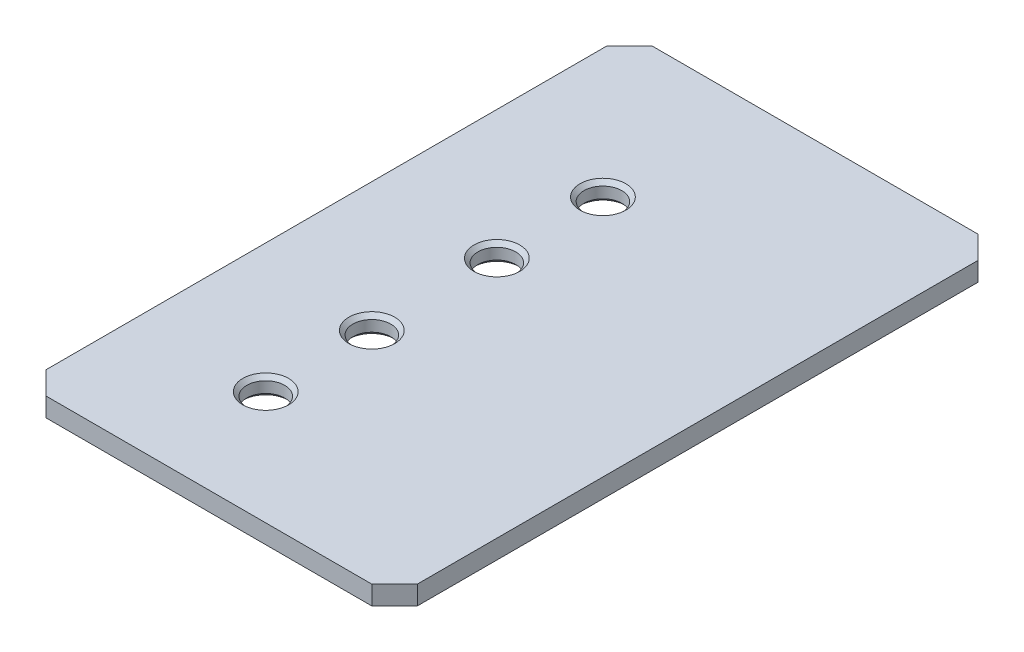
ISO-10303-21;
HEADER;
FILE_DESCRIPTION(('STEP AP214'),'2;1');
FILE_NAME('part.step','',(''),(''),'','','');
FILE_SCHEMA(('AUTOMOTIVE_DESIGN { 1 0 10303 214 1 1 1 1 }'));
ENDSEC;
DATA;
#1=APPLICATION_CONTEXT('core data for automotive mechanical design processes');
#2=APPLICATION_PROTOCOL_DEFINITION('international standard','automotive_design',2000,#1);
#3=PRODUCT_CONTEXT('',#1,'mechanical');
#4=PRODUCT('Part','Part','',(#3));
#5=PRODUCT_RELATED_PRODUCT_CATEGORY('part','',(#4));
#6=PRODUCT_DEFINITION_FORMATION('','',#4);
#7=PRODUCT_DEFINITION_CONTEXT('part definition',#1,'design');
#8=PRODUCT_DEFINITION('design','',#6,#7);
#9=PRODUCT_DEFINITION_SHAPE('','',#8);
#10=(LENGTH_UNIT() NAMED_UNIT(*) SI_UNIT(.MILLI.,.METRE.));
#11=(NAMED_UNIT(*) PLANE_ANGLE_UNIT() SI_UNIT($,.RADIAN.));
#12=(NAMED_UNIT(*) SI_UNIT($,.STERADIAN.) SOLID_ANGLE_UNIT());
#13=UNCERTAINTY_MEASURE_WITH_UNIT(LENGTH_MEASURE(1.E-05),#10,'distance_accuracy_value','');
#14=(GEOMETRIC_REPRESENTATION_CONTEXT(3) GLOBAL_UNCERTAINTY_ASSIGNED_CONTEXT((#13)) GLOBAL_UNIT_ASSIGNED_CONTEXT((#10,
#11,#12)) REPRESENTATION_CONTEXT('',''));
#15=CARTESIAN_POINT('',(0.,0.,0.));
#16=DIRECTION('',(0.,0.,1.));
#17=DIRECTION('',(1.,0.,0.));
#18=AXIS2_PLACEMENT_3D('',#15,#16,#17);
#19=CARTESIAN_POINT('',(-24.5,2.5,-37.));
#20=DIRECTION('',(0.707106781186546,0.,0.707106781186549));
#21=DIRECTION('',(0.,-1.,0.));
#22=AXIS2_PLACEMENT_3D('',#19,#20,#21);
#23=PLANE('',#22);
#24=DIRECTION('',(-0.707106781186549,0.,0.707106781186546));
#25=VECTOR('',#24,1.);
#26=CARTESIAN_POINT('',(-30.75,2.5,-30.75));
#27=LINE('',#26,#25);
#28=CARTESIAN_POINT('',(-21.5,2.5,-40.));
#29=VERTEX_POINT('',#28);
#30=CARTESIAN_POINT('',(-24.5,2.5,-37.));
#31=VERTEX_POINT('',#30);
#32=EDGE_CURVE('E169',#29,#31,#27,.T.);
#33=ORIENTED_EDGE('',*,*,#32,.F.);
#34=DIRECTION('',(0.,1.,0.));
#35=VECTOR('',#34,1.);
#36=CARTESIAN_POINT('',(-21.5,2.5,-40.));
#37=LINE('',#36,#35);
#38=CARTESIAN_POINT('',(-21.5,0.,-40.));
#39=VERTEX_POINT('',#38);
#40=EDGE_CURVE('E185',#39,#29,#37,.T.);
#41=ORIENTED_EDGE('',*,*,#40,.F.);
#42=DIRECTION('',(0.707106781186549,0.,-0.707106781186546));
#43=VECTOR('',#42,1.);
#44=CARTESIAN_POINT('',(-24.5,0.,-37.));
#45=LINE('',#44,#43);
#46=CARTESIAN_POINT('',(-24.5,0.,-37.));
#47=VERTEX_POINT('',#46);
#48=EDGE_CURVE('E272',#47,#39,#45,.T.);
#49=ORIENTED_EDGE('',*,*,#48,.F.);
#50=DIRECTION('',(0.,-1.,0.));
#51=VECTOR('',#50,1.);
#52=CARTESIAN_POINT('',(-24.5,2.5,-37.));
#53=LINE('',#52,#51);
#54=EDGE_CURVE('E221',#31,#47,#53,.T.);
#55=ORIENTED_EDGE('',*,*,#54,.F.);
#56=EDGE_LOOP('',(#33,#41,#49,#55));
#57=FACE_BOUND('',#56,.T.);
#58=ADVANCED_FACE('F17',(#57),#23,.F.);
#59=CARTESIAN_POINT('',(-21.5,2.5,40.));
#60=DIRECTION('',(0.707106781186549,0.,-0.707106781186546));
#61=DIRECTION('',(0.,-1.,0.));
#62=AXIS2_PLACEMENT_3D('',#59,#60,#61);
#63=PLANE('',#62);
#64=DIRECTION('',(0.707106781186546,0.,0.707106781186549));
#65=VECTOR('',#64,1.);
#66=CARTESIAN_POINT('',(-30.75,2.5,30.75));
#67=LINE('',#66,#65);
#68=CARTESIAN_POINT('',(-24.5,2.5,37.));
#69=VERTEX_POINT('',#68);
#70=CARTESIAN_POINT('',(-21.5,2.5,40.));
#71=VERTEX_POINT('',#70);
#72=EDGE_CURVE('E209',#69,#71,#67,.T.);
#73=ORIENTED_EDGE('',*,*,#72,.F.);
#74=DIRECTION('',(0.,1.,0.));
#75=VECTOR('',#74,1.);
#76=CARTESIAN_POINT('',(-24.5,2.5,37.));
#77=LINE('',#76,#75);
#78=CARTESIAN_POINT('',(-24.5,0.,37.));
#79=VERTEX_POINT('',#78);
#80=EDGE_CURVE('E200',#79,#69,#77,.T.);
#81=ORIENTED_EDGE('',*,*,#80,.F.);
#82=DIRECTION('',(-0.707106781186546,0.,-0.707106781186549));
#83=VECTOR('',#82,1.);
#84=CARTESIAN_POINT('',(-21.5,0.,40.));
#85=LINE('',#84,#83);
#86=CARTESIAN_POINT('',(-21.5,0.,40.));
#87=VERTEX_POINT('',#86);
#88=EDGE_CURVE('E268',#87,#79,#85,.T.);
#89=ORIENTED_EDGE('',*,*,#88,.F.);
#90=DIRECTION('',(0.,-1.,0.));
#91=VECTOR('',#90,1.);
#92=CARTESIAN_POINT('',(-21.5,2.5,40.));
#93=LINE('',#92,#91);
#94=EDGE_CURVE('E213',#71,#87,#93,.T.);
#95=ORIENTED_EDGE('',*,*,#94,.F.);
#96=EDGE_LOOP('',(#73,#81,#89,#95));
#97=FACE_BOUND('',#96,.T.);
#98=ADVANCED_FACE('F531',(#97),#63,.F.);
#99=CARTESIAN_POINT('',(21.5,2.5,-40.));
#100=DIRECTION('',(-0.707106781186548,0.,0.707106781186548));
#101=DIRECTION('',(0.,1.,0.));
#102=AXIS2_PLACEMENT_3D('',#99,#100,#101);
#103=PLANE('',#102);
#104=DIRECTION('',(-0.707106781186548,0.,-0.707106781186548));
#105=VECTOR('',#104,1.);
#106=CARTESIAN_POINT('',(30.75,2.5,-30.75));
#107=LINE('',#106,#105);
#108=CARTESIAN_POINT('',(24.5,2.5,-37.));
#109=VERTEX_POINT('',#108);
#110=CARTESIAN_POINT('',(21.5,2.5,-40.));
#111=VERTEX_POINT('',#110);
#112=EDGE_CURVE('E157',#109,#111,#107,.T.);
#113=ORIENTED_EDGE('',*,*,#112,.F.);
#114=DIRECTION('',(0.,1.,0.));
#115=VECTOR('',#114,1.);
#116=CARTESIAN_POINT('',(24.5,2.5,-37.));
#117=LINE('',#116,#115);
#118=CARTESIAN_POINT('',(24.5,0.,-37.));
#119=VERTEX_POINT('',#118);
#120=EDGE_CURVE('E187',#119,#109,#117,.T.);
#121=ORIENTED_EDGE('',*,*,#120,.F.);
#122=DIRECTION('',(0.707106781186548,0.,0.707106781186548));
#123=VECTOR('',#122,1.);
#124=CARTESIAN_POINT('',(21.5,0.,-40.));
#125=LINE('',#124,#123);
#126=CARTESIAN_POINT('',(21.5,0.,-40.));
#127=VERTEX_POINT('',#126);
#128=EDGE_CURVE('E175',#127,#119,#125,.T.);
#129=ORIENTED_EDGE('',*,*,#128,.F.);
#130=DIRECTION('',(0.,-1.,0.));
#131=VECTOR('',#130,1.);
#132=CARTESIAN_POINT('',(21.5,2.5,-40.));
#133=LINE('',#132,#131);
#134=EDGE_CURVE('E173',#111,#127,#133,.T.);
#135=ORIENTED_EDGE('',*,*,#134,.F.);
#136=EDGE_LOOP('',(#113,#121,#129,#135));
#137=FACE_BOUND('',#136,.T.);
#138=ADVANCED_FACE('F174',(#137),#103,.F.);
#139=CARTESIAN_POINT('',(24.5,2.5,37.));
#140=DIRECTION('',(-0.707106781186548,0.,-0.707106781186548));
#141=DIRECTION('',(-0.707106781186548,0.,0.707106781186548));
#142=AXIS2_PLACEMENT_3D('',#139,#140,#141);
#143=PLANE('',#142);
#144=DIRECTION('',(0.707106781186548,0.,-0.707106781186548));
#145=VECTOR('',#144,1.);
#146=CARTESIAN_POINT('',(30.75,2.5,30.75));
#147=LINE('',#146,#145);
#148=CARTESIAN_POINT('',(21.5,2.5,40.));
#149=VERTEX_POINT('',#148);
#150=CARTESIAN_POINT('',(24.5,2.5,37.));
#151=VERTEX_POINT('',#150);
#152=EDGE_CURVE('E170',#149,#151,#147,.T.);
#153=ORIENTED_EDGE('',*,*,#152,.F.);
#154=DIRECTION('',(0.,1.,0.));
#155=VECTOR('',#154,1.);
#156=CARTESIAN_POINT('',(21.5,2.5,40.));
#157=LINE('',#156,#155);
#158=CARTESIAN_POINT('',(21.5,0.,40.));
#159=VERTEX_POINT('',#158);
#160=EDGE_CURVE('E233',#159,#149,#157,.T.);
#161=ORIENTED_EDGE('',*,*,#160,.F.);
#162=DIRECTION('',(-0.707106781186548,0.,0.707106781186548));
#163=VECTOR('',#162,1.);
#164=CARTESIAN_POINT('',(24.5,0.,37.));
#165=LINE('',#164,#163);
#166=CARTESIAN_POINT('',(24.5,0.,37.));
#167=VERTEX_POINT('',#166);
#168=EDGE_CURVE('E229',#167,#159,#165,.T.);
#169=ORIENTED_EDGE('',*,*,#168,.F.);
#170=DIRECTION('',(0.,-1.,0.));
#171=VECTOR('',#170,1.);
#172=CARTESIAN_POINT('',(24.5,2.5,37.));
#173=LINE('',#172,#171);
#174=EDGE_CURVE('E212',#151,#167,#173,.T.);
#175=ORIENTED_EDGE('',*,*,#174,.F.);
#176=EDGE_LOOP('',(#153,#161,#169,#175));
#177=FACE_BOUND('',#176,.T.);
#178=ADVANCED_FACE('F510',(#177),#143,.F.);
#179=CARTESIAN_POINT('',(-7.5,2.5,-19.5));
#180=DIRECTION('',(0.,1.,0.));
#181=DIRECTION('',(0.,0.,1.));
#182=AXIS2_PLACEMENT_3D('',#179,#180,#181);
#183=CONICAL_SURFACE('',#182,3.025,0.785398163397446);
#184=CARTESIAN_POINT('',(-7.5,1.975,-19.5));
#185=DIRECTION('',(0.,1.,0.));
#186=DIRECTION('',(0.,0.,1.));
#187=AXIS2_PLACEMENT_3D('',#184,#185,#186);
#188=CIRCLE('',#187,2.5);
#189=CARTESIAN_POINT('',(-7.5,1.975,-17.));
#190=VERTEX_POINT('',#189);
#191=EDGE_CURVE('E11',#190,#190,#188,.T.);
#192=ORIENTED_EDGE('',*,*,#191,.F.);
#193=EDGE_LOOP('',(#192));
#194=FACE_BOUND('',#193,.T.);
#195=CARTESIAN_POINT('',(-7.5,2.5,-19.5));
#196=DIRECTION('',(0.,1.,0.));
#197=DIRECTION('',(0.,0.,1.));
#198=AXIS2_PLACEMENT_3D('',#195,#196,#197);
#199=CIRCLE('',#198,3.025);
#200=CARTESIAN_POINT('',(-7.5,2.5,-16.475));
#201=VERTEX_POINT('',#200);
#202=EDGE_CURVE('E205',#201,#201,#199,.T.);
#203=ORIENTED_EDGE('',*,*,#202,.T.);
#204=EDGE_LOOP('',(#203));
#205=FACE_BOUND('',#204,.T.);
#206=ADVANCED_FACE('F500',(#194,#205),#183,.F.);
#207=CARTESIAN_POINT('',(-7.5,2.5,-19.5));
#208=DIRECTION('',(0.,1.,0.));
#209=DIRECTION('',(0.,0.,1.));
#210=AXIS2_PLACEMENT_3D('',#207,#208,#209);
#211=CYLINDRICAL_SURFACE('',#210,2.5);
#212=CARTESIAN_POINT('',(-7.5,0.525,-19.5));
#213=DIRECTION('',(0.,1.,0.));
#214=DIRECTION('',(0.,0.,1.));
#215=AXIS2_PLACEMENT_3D('',#212,#213,#214);
#216=CIRCLE('',#215,2.5);
#217=CARTESIAN_POINT('',(-7.5,0.525,-17.));
#218=VERTEX_POINT('',#217);
#219=EDGE_CURVE('E27',#218,#218,#216,.T.);
#220=ORIENTED_EDGE('',*,*,#219,.F.);
#221=EDGE_LOOP('',(#220));
#222=FACE_BOUND('',#221,.T.);
#223=ORIENTED_EDGE('',*,*,#191,.T.);
#224=EDGE_LOOP('',(#223));
#225=FACE_BOUND('',#224,.T.);
#226=ADVANCED_FACE('F490',(#222,#225),#211,.F.);
#227=CARTESIAN_POINT('',(-7.5,0.525,-19.5));
#228=DIRECTION('',(0.,-1.,0.));
#229=DIRECTION('',(0.,0.,-1.));
#230=AXIS2_PLACEMENT_3D('',#227,#228,#229);
#231=CONICAL_SURFACE('',#230,2.5,0.785398163397446);
#232=ORIENTED_EDGE('',*,*,#219,.T.);
#233=EDGE_LOOP('',(#232));
#234=FACE_BOUND('',#233,.T.);
#235=CARTESIAN_POINT('',(-7.5,0.,-19.5));
#236=DIRECTION('',(0.,1.,0.));
#237=DIRECTION('',(0.,0.,1.));
#238=AXIS2_PLACEMENT_3D('',#235,#236,#237);
#239=CIRCLE('',#238,3.025);
#240=CARTESIAN_POINT('',(-7.5,0.,-16.475));
#241=VERTEX_POINT('',#240);
#242=EDGE_CURVE('E201',#241,#241,#239,.T.);
#243=ORIENTED_EDGE('',*,*,#242,.F.);
#244=EDGE_LOOP('',(#243));
#245=FACE_BOUND('',#244,.T.);
#246=ADVANCED_FACE('F480',(#234,#245),#231,.F.);
#247=CARTESIAN_POINT('',(-7.5,2.5,-5.5));
#248=DIRECTION('',(0.,1.,0.));
#249=DIRECTION('',(0.,0.,1.));
#250=AXIS2_PLACEMENT_3D('',#247,#248,#249);
#251=CONICAL_SURFACE('',#250,3.025,0.785398163397446);
#252=CARTESIAN_POINT('',(-7.5,1.975,-5.5));
#253=DIRECTION('',(0.,1.,0.));
#254=DIRECTION('',(0.,0.,1.));
#255=AXIS2_PLACEMENT_3D('',#252,#253,#254);
#256=CIRCLE('',#255,2.5);
#257=CARTESIAN_POINT('',(-7.5,1.975,-3.));
#258=VERTEX_POINT('',#257);
#259=EDGE_CURVE('E20',#258,#258,#256,.T.);
#260=ORIENTED_EDGE('',*,*,#259,.F.);
#261=EDGE_LOOP('',(#260));
#262=FACE_BOUND('',#261,.T.);
#263=CARTESIAN_POINT('',(-7.5,2.5,-5.5));
#264=DIRECTION('',(0.,1.,0.));
#265=DIRECTION('',(0.,0.,1.));
#266=AXIS2_PLACEMENT_3D('',#263,#264,#265);
#267=CIRCLE('',#266,3.025);
#268=CARTESIAN_POINT('',(-7.5,2.5,-2.475));
#269=VERTEX_POINT('',#268);
#270=EDGE_CURVE('E208',#269,#269,#267,.T.);
#271=ORIENTED_EDGE('',*,*,#270,.T.);
#272=EDGE_LOOP('',(#271));
#273=FACE_BOUND('',#272,.T.);
#274=ADVANCED_FACE('F469',(#262,#273),#251,.F.);
#275=CARTESIAN_POINT('',(-7.5,2.5,-5.5));
#276=DIRECTION('',(0.,1.,0.));
#277=DIRECTION('',(0.,0.,1.));
#278=AXIS2_PLACEMENT_3D('',#275,#276,#277);
#279=CYLINDRICAL_SURFACE('',#278,2.5);
#280=CARTESIAN_POINT('',(-7.5,0.525,-5.5));
#281=DIRECTION('',(0.,1.,0.));
#282=DIRECTION('',(0.,0.,1.));
#283=AXIS2_PLACEMENT_3D('',#280,#281,#282);
#284=CIRCLE('',#283,2.5);
#285=CARTESIAN_POINT('',(-7.5,0.525,-3.));
#286=VERTEX_POINT('',#285);
#287=EDGE_CURVE('E112',#286,#286,#284,.T.);
#288=ORIENTED_EDGE('',*,*,#287,.F.);
#289=EDGE_LOOP('',(#288));
#290=FACE_BOUND('',#289,.T.);
#291=ORIENTED_EDGE('',*,*,#259,.T.);
#292=EDGE_LOOP('',(#291));
#293=FACE_BOUND('',#292,.T.);
#294=ADVANCED_FACE('F460',(#290,#293),#279,.F.);
#295=CARTESIAN_POINT('',(-7.5,0.525,-5.5));
#296=DIRECTION('',(0.,-1.,0.));
#297=DIRECTION('',(0.,0.,-1.));
#298=AXIS2_PLACEMENT_3D('',#295,#296,#297);
#299=CONICAL_SURFACE('',#298,2.5,0.785398163397446);
#300=ORIENTED_EDGE('',*,*,#287,.T.);
#301=EDGE_LOOP('',(#300));
#302=FACE_BOUND('',#301,.T.);
#303=CARTESIAN_POINT('',(-7.5,0.,-5.5));
#304=DIRECTION('',(0.,1.,0.));
#305=DIRECTION('',(0.,0.,1.));
#306=AXIS2_PLACEMENT_3D('',#303,#304,#305);
#307=CIRCLE('',#306,3.025);
#308=CARTESIAN_POINT('',(-7.5,0.,-2.475));
#309=VERTEX_POINT('',#308);
#310=EDGE_CURVE('E204',#309,#309,#307,.T.);
#311=ORIENTED_EDGE('',*,*,#310,.F.);
#312=EDGE_LOOP('',(#311));
#313=FACE_BOUND('',#312,.T.);
#314=ADVANCED_FACE('F450',(#302,#313),#299,.F.);
#315=CARTESIAN_POINT('',(-7.5,2.5,25.));
#316=DIRECTION('',(0.,1.,0.));
#317=DIRECTION('',(0.,0.,1.));
#318=AXIS2_PLACEMENT_3D('',#315,#316,#317);
#319=CONICAL_SURFACE('',#318,3.025,0.785398163397446);
#320=CARTESIAN_POINT('',(-7.5,1.975,25.));
#321=DIRECTION('',(0.,1.,0.));
#322=DIRECTION('',(0.,0.,1.));
#323=AXIS2_PLACEMENT_3D('',#320,#321,#322);
#324=CIRCLE('',#323,2.5);
#325=CARTESIAN_POINT('',(-7.5,1.975,27.5));
#326=VERTEX_POINT('',#325);
#327=EDGE_CURVE('E243',#326,#326,#324,.T.);
#328=ORIENTED_EDGE('',*,*,#327,.F.);
#329=EDGE_LOOP('',(#328));
#330=FACE_BOUND('',#329,.T.);
#331=CARTESIAN_POINT('',(-7.5,2.5,25.));
#332=DIRECTION('',(0.,1.,0.));
#333=DIRECTION('',(0.,0.,1.));
#334=AXIS2_PLACEMENT_3D('',#331,#332,#333);
#335=CIRCLE('',#334,3.025);
#336=CARTESIAN_POINT('',(-7.5,2.5,28.025));
#337=VERTEX_POINT('',#336);
#338=EDGE_CURVE('E230',#337,#337,#335,.T.);
#339=ORIENTED_EDGE('',*,*,#338,.T.);
#340=EDGE_LOOP('',(#339));
#341=FACE_BOUND('',#340,.T.);
#342=ADVANCED_FACE('F439',(#330,#341),#319,.F.);
#343=CARTESIAN_POINT('',(-7.5,2.5,25.));
#344=DIRECTION('',(0.,1.,0.));
#345=DIRECTION('',(0.,0.,1.));
#346=AXIS2_PLACEMENT_3D('',#343,#344,#345);
#347=CYLINDRICAL_SURFACE('',#346,2.5);
#348=CARTESIAN_POINT('',(-7.5,0.525,25.));
#349=DIRECTION('',(0.,1.,0.));
#350=DIRECTION('',(0.,0.,1.));
#351=AXIS2_PLACEMENT_3D('',#348,#349,#350);
#352=CIRCLE('',#351,2.5);
#353=CARTESIAN_POINT('',(-7.5,0.525,27.5));
#354=VERTEX_POINT('',#353);
#355=EDGE_CURVE('E246',#354,#354,#352,.T.);
#356=ORIENTED_EDGE('',*,*,#355,.F.);
#357=EDGE_LOOP('',(#356));
#358=FACE_BOUND('',#357,.T.);
#359=ORIENTED_EDGE('',*,*,#327,.T.);
#360=EDGE_LOOP('',(#359));
#361=FACE_BOUND('',#360,.T.);
#362=ADVANCED_FACE('F427',(#358,#361),#347,.F.);
#363=CARTESIAN_POINT('',(-7.5,0.525,25.));
#364=DIRECTION('',(0.,-1.,0.));
#365=DIRECTION('',(0.,0.,-1.));
#366=AXIS2_PLACEMENT_3D('',#363,#364,#365);
#367=CONICAL_SURFACE('',#366,2.5,0.785398163397446);
#368=ORIENTED_EDGE('',*,*,#355,.T.);
#369=EDGE_LOOP('',(#368));
#370=FACE_BOUND('',#369,.T.);
#371=CARTESIAN_POINT('',(-7.5,0.,25.));
#372=DIRECTION('',(0.,1.,0.));
#373=DIRECTION('',(0.,0.,1.));
#374=AXIS2_PLACEMENT_3D('',#371,#372,#373);
#375=CIRCLE('',#374,3.025);
#376=CARTESIAN_POINT('',(-7.5,0.,28.025));
#377=VERTEX_POINT('',#376);
#378=EDGE_CURVE('E284',#377,#377,#375,.T.);
#379=ORIENTED_EDGE('',*,*,#378,.F.);
#380=EDGE_LOOP('',(#379));
#381=FACE_BOUND('',#380,.T.);
#382=ADVANCED_FACE('F416',(#370,#381),#367,.F.);
#383=CARTESIAN_POINT('',(-7.5,2.5,11.));
#384=DIRECTION('',(0.,1.,0.));
#385=DIRECTION('',(0.,0.,1.));
#386=AXIS2_PLACEMENT_3D('',#383,#384,#385);
#387=CONICAL_SURFACE('',#386,3.025,0.785398163397446);
#388=CARTESIAN_POINT('',(-7.5,1.975,11.));
#389=DIRECTION('',(0.,1.,0.));
#390=DIRECTION('',(0.,0.,1.));
#391=AXIS2_PLACEMENT_3D('',#388,#389,#390);
#392=CIRCLE('',#391,2.5);
#393=CARTESIAN_POINT('',(-7.5,1.975,13.5));
#394=VERTEX_POINT('',#393);
#395=EDGE_CURVE('E293',#394,#394,#392,.T.);
#396=ORIENTED_EDGE('',*,*,#395,.F.);
#397=EDGE_LOOP('',(#396));
#398=FACE_BOUND('',#397,.T.);
#399=CARTESIAN_POINT('',(-7.5,2.5,11.));
#400=DIRECTION('',(0.,1.,0.));
#401=DIRECTION('',(0.,0.,1.));
#402=AXIS2_PLACEMENT_3D('',#399,#400,#401);
#403=CIRCLE('',#402,3.025);
#404=CARTESIAN_POINT('',(-7.5,2.5,14.025));
#405=VERTEX_POINT('',#404);
#406=EDGE_CURVE('E226',#405,#405,#403,.T.);
#407=ORIENTED_EDGE('',*,*,#406,.T.);
#408=EDGE_LOOP('',(#407));
#409=FACE_BOUND('',#408,.T.);
#410=ADVANCED_FACE('F405',(#398,#409),#387,.F.);
#411=CARTESIAN_POINT('',(-7.5,2.5,11.));
#412=DIRECTION('',(0.,1.,0.));
#413=DIRECTION('',(0.,0.,1.));
#414=AXIS2_PLACEMENT_3D('',#411,#412,#413);
#415=CYLINDRICAL_SURFACE('',#414,2.5);
#416=CARTESIAN_POINT('',(-7.5,0.525,11.));
#417=DIRECTION('',(0.,1.,0.));
#418=DIRECTION('',(0.,0.,1.));
#419=AXIS2_PLACEMENT_3D('',#416,#417,#418);
#420=CIRCLE('',#419,2.5);
#421=CARTESIAN_POINT('',(-7.5,0.525,13.5));
#422=VERTEX_POINT('',#421);
#423=EDGE_CURVE('E290',#422,#422,#420,.T.);
#424=ORIENTED_EDGE('',*,*,#423,.F.);
#425=EDGE_LOOP('',(#424));
#426=FACE_BOUND('',#425,.T.);
#427=ORIENTED_EDGE('',*,*,#395,.T.);
#428=EDGE_LOOP('',(#427));
#429=FACE_BOUND('',#428,.T.);
#430=ADVANCED_FACE('F394',(#426,#429),#415,.F.);
#431=CARTESIAN_POINT('',(-7.5,0.525,11.));
#432=DIRECTION('',(0.,-1.,0.));
#433=DIRECTION('',(0.,0.,-1.));
#434=AXIS2_PLACEMENT_3D('',#431,#432,#433);
#435=CONICAL_SURFACE('',#434,2.5,0.785398163397446);
#436=ORIENTED_EDGE('',*,*,#423,.T.);
#437=EDGE_LOOP('',(#436));
#438=FACE_BOUND('',#437,.T.);
#439=CARTESIAN_POINT('',(-7.5,0.,11.));
#440=DIRECTION('',(0.,1.,0.));
#441=DIRECTION('',(0.,0.,1.));
#442=AXIS2_PLACEMENT_3D('',#439,#440,#441);
#443=CIRCLE('',#442,3.025);
#444=CARTESIAN_POINT('',(-7.5,0.,14.025));
#445=VERTEX_POINT('',#444);
#446=EDGE_CURVE('E287',#445,#445,#443,.T.);
#447=ORIENTED_EDGE('',*,*,#446,.F.);
#448=EDGE_LOOP('',(#447));
#449=FACE_BOUND('',#448,.T.);
#450=ADVANCED_FACE('F383',(#438,#449),#435,.F.);
#451=CARTESIAN_POINT('',(0.,0.,0.));
#452=DIRECTION('',(0.,1.,0.));
#453=DIRECTION('',(1.,0.,0.));
#454=AXIS2_PLACEMENT_3D('',#451,#452,#453);
#455=PLANE('',#454);
#456=ORIENTED_EDGE('',*,*,#446,.T.);
#457=EDGE_LOOP('',(#456));
#458=FACE_BOUND('',#457,.T.);
#459=ORIENTED_EDGE('',*,*,#378,.T.);
#460=EDGE_LOOP('',(#459));
#461=FACE_BOUND('',#460,.T.);
#462=ORIENTED_EDGE('',*,*,#310,.T.);
#463=EDGE_LOOP('',(#462));
#464=FACE_BOUND('',#463,.T.);
#465=ORIENTED_EDGE('',*,*,#242,.T.);
#466=EDGE_LOOP('',(#465));
#467=FACE_BOUND('',#466,.T.);
#468=DIRECTION('',(0.,0.,-1.));
#469=VECTOR('',#468,1.);
#470=CARTESIAN_POINT('',(24.5,0.,40.));
#471=LINE('',#470,#469);
#472=EDGE_CURVE('E193',#167,#119,#471,.T.);
#473=ORIENTED_EDGE('',*,*,#472,.F.);
#474=ORIENTED_EDGE('',*,*,#168,.T.);
#475=DIRECTION('',(1.,0.,0.));
#476=VECTOR('',#475,1.);
#477=CARTESIAN_POINT('',(24.5,0.,40.));
#478=LINE('',#477,#476);
#479=EDGE_CURVE('E225',#87,#159,#478,.T.);
#480=ORIENTED_EDGE('',*,*,#479,.F.);
#481=ORIENTED_EDGE('',*,*,#88,.T.);
#482=DIRECTION('',(0.,0.,1.));
#483=VECTOR('',#482,1.);
#484=CARTESIAN_POINT('',(-24.5,0.,40.));
#485=LINE('',#484,#483);
#486=EDGE_CURVE('E196',#47,#79,#485,.T.);
#487=ORIENTED_EDGE('',*,*,#486,.F.);
#488=ORIENTED_EDGE('',*,*,#48,.T.);
#489=DIRECTION('',(-1.,0.,0.));
#490=VECTOR('',#489,1.);
#491=CARTESIAN_POINT('',(24.5,0.,-40.));
#492=LINE('',#491,#490);
#493=EDGE_CURVE('E180',#127,#39,#492,.T.);
#494=ORIENTED_EDGE('',*,*,#493,.F.);
#495=ORIENTED_EDGE('',*,*,#128,.T.);
#496=EDGE_LOOP('',(#473,#474,#480,#481,#487,#488,#494,#495));
#497=FACE_BOUND('',#496,.T.);
#498=ADVANCED_FACE('F370',(#458,#461,#464,#467,#497),#455,.F.);
#499=CARTESIAN_POINT('',(0.,2.5,0.));
#500=DIRECTION('',(0.,1.,0.));
#501=DIRECTION('',(1.,0.,0.));
#502=AXIS2_PLACEMENT_3D('',#499,#500,#501);
#503=PLANE('',#502);
#504=ORIENTED_EDGE('',*,*,#406,.F.);
#505=EDGE_LOOP('',(#504));
#506=FACE_BOUND('',#505,.T.);
#507=ORIENTED_EDGE('',*,*,#338,.F.);
#508=EDGE_LOOP('',(#507));
#509=FACE_BOUND('',#508,.T.);
#510=ORIENTED_EDGE('',*,*,#270,.F.);
#511=EDGE_LOOP('',(#510));
#512=FACE_BOUND('',#511,.T.);
#513=ORIENTED_EDGE('',*,*,#202,.F.);
#514=EDGE_LOOP('',(#513));
#515=FACE_BOUND('',#514,.T.);
#516=DIRECTION('',(1.,0.,0.));
#517=VECTOR('',#516,1.);
#518=CARTESIAN_POINT('',(24.5,2.5,40.));
#519=LINE('',#518,#517);
#520=EDGE_CURVE('E238',#71,#149,#519,.T.);
#521=ORIENTED_EDGE('',*,*,#520,.T.);
#522=ORIENTED_EDGE('',*,*,#152,.T.);
#523=DIRECTION('',(0.,0.,-1.));
#524=VECTOR('',#523,1.);
#525=CARTESIAN_POINT('',(24.5,2.5,40.));
#526=LINE('',#525,#524);
#527=EDGE_CURVE('E164',#151,#109,#526,.T.);
#528=ORIENTED_EDGE('',*,*,#527,.T.);
#529=ORIENTED_EDGE('',*,*,#112,.T.);
#530=DIRECTION('',(-1.,0.,0.));
#531=VECTOR('',#530,1.);
#532=CARTESIAN_POINT('',(24.5,2.5,-40.));
#533=LINE('',#532,#531);
#534=EDGE_CURVE('E162',#111,#29,#533,.T.);
#535=ORIENTED_EDGE('',*,*,#534,.T.);
#536=ORIENTED_EDGE('',*,*,#32,.T.);
#537=DIRECTION('',(0.,0.,1.));
#538=VECTOR('',#537,1.);
#539=CARTESIAN_POINT('',(-24.5,2.5,40.));
#540=LINE('',#539,#538);
#541=EDGE_CURVE('E217',#31,#69,#540,.T.);
#542=ORIENTED_EDGE('',*,*,#541,.T.);
#543=ORIENTED_EDGE('',*,*,#72,.T.);
#544=EDGE_LOOP('',(#521,#522,#528,#529,#535,#536,#542,#543));
#545=FACE_BOUND('',#544,.T.);
#546=ADVANCED_FACE('F160',(#506,#509,#512,#515,#545),#503,.T.);
#547=CARTESIAN_POINT('',(24.5,2.5,-40.));
#548=DIRECTION('',(0.,0.,1.));
#549=DIRECTION('',(1.,0.,0.));
#550=AXIS2_PLACEMENT_3D('',#547,#548,#549);
#551=PLANE('',#550);
#552=ORIENTED_EDGE('',*,*,#534,.F.);
#553=ORIENTED_EDGE('',*,*,#134,.T.);
#554=ORIENTED_EDGE('',*,*,#493,.T.);
#555=ORIENTED_EDGE('',*,*,#40,.T.);
#556=EDGE_LOOP('',(#552,#553,#554,#555));
#557=FACE_BOUND('',#556,.T.);
#558=ADVANCED_FACE('F183',(#557),#551,.F.);
#559=CARTESIAN_POINT('',(24.5,2.5,40.));
#560=DIRECTION('',(-1.,0.,0.));
#561=DIRECTION('',(0.,0.,1.));
#562=AXIS2_PLACEMENT_3D('',#559,#560,#561);
#563=PLANE('',#562);
#564=ORIENTED_EDGE('',*,*,#527,.F.);
#565=ORIENTED_EDGE('',*,*,#174,.T.);
#566=ORIENTED_EDGE('',*,*,#472,.T.);
#567=ORIENTED_EDGE('',*,*,#120,.T.);
#568=EDGE_LOOP('',(#564,#565,#566,#567));
#569=FACE_BOUND('',#568,.T.);
#570=ADVANCED_FACE('F339',(#569),#563,.F.);
#571=CARTESIAN_POINT('',(24.5,2.5,40.));
#572=DIRECTION('',(0.,0.,-1.));
#573=DIRECTION('',(-1.,0.,0.));
#574=AXIS2_PLACEMENT_3D('',#571,#572,#573);
#575=PLANE('',#574);
#576=ORIENTED_EDGE('',*,*,#479,.T.);
#577=ORIENTED_EDGE('',*,*,#160,.T.);
#578=ORIENTED_EDGE('',*,*,#520,.F.);
#579=ORIENTED_EDGE('',*,*,#94,.T.);
#580=EDGE_LOOP('',(#576,#577,#578,#579));
#581=FACE_BOUND('',#580,.T.);
#582=ADVANCED_FACE('F327',(#581),#575,.F.);
#583=CARTESIAN_POINT('',(-24.5,2.5,40.));
#584=DIRECTION('',(1.,0.,0.));
#585=DIRECTION('',(0.,1.,0.));
#586=AXIS2_PLACEMENT_3D('',#583,#584,#585);
#587=PLANE('',#586);
#588=ORIENTED_EDGE('',*,*,#486,.T.);
#589=ORIENTED_EDGE('',*,*,#80,.T.);
#590=ORIENTED_EDGE('',*,*,#541,.F.);
#591=ORIENTED_EDGE('',*,*,#54,.T.);
#592=EDGE_LOOP('',(#588,#589,#590,#591));
#593=FACE_BOUND('',#592,.T.);
#594=ADVANCED_FACE('F321',(#593),#587,.F.);
#595=CLOSED_SHELL('',(#58,#98,#138,#178,#206,#226,#246,#274,#294,#314,#342,#362,#382,#410,#430,
#450,#498,#546,#558,#570,#582,#594));
#596=MANIFOLD_SOLID_BREP('B1',#595);
#597=ADVANCED_BREP_SHAPE_REPRESENTATION('',(#18,#596),#14);
#598=SHAPE_DEFINITION_REPRESENTATION(#9,#597);
ENDSEC;
END-ISO-10303-21;
